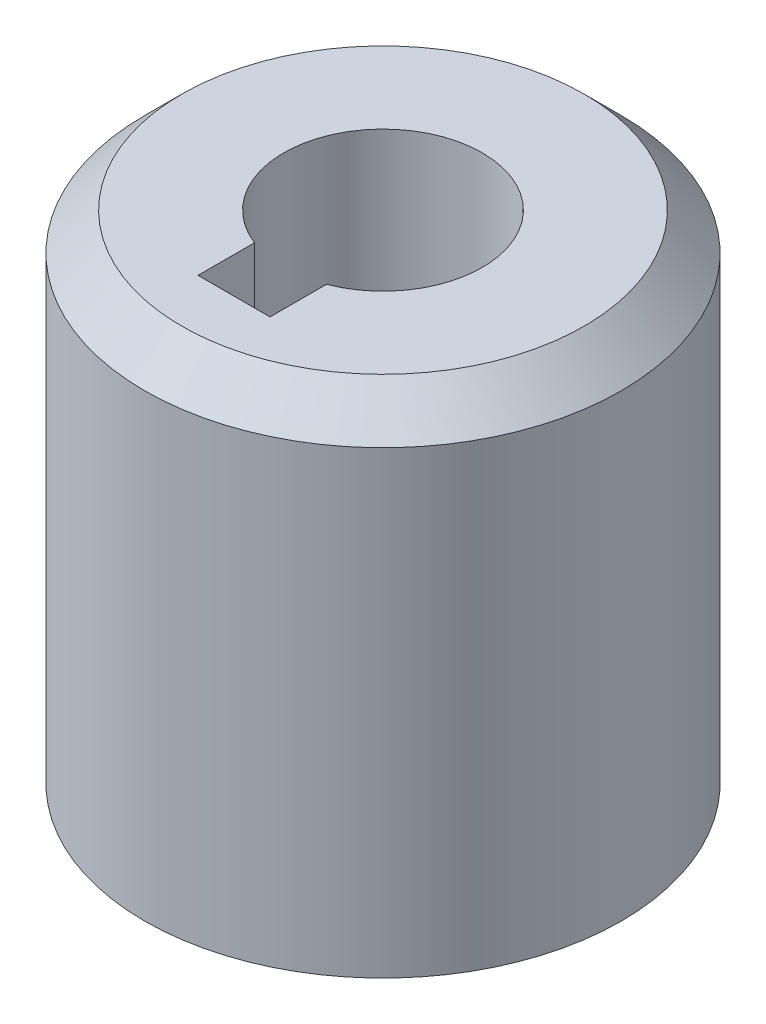
ISO-10303-21;
HEADER;
FILE_DESCRIPTION(('STEP AP214'),'2;1');
FILE_NAME('part.step','',(''),(''),'','','');
FILE_SCHEMA(('AUTOMOTIVE_DESIGN { 1 0 10303 214 1 1 1 1 }'));
ENDSEC;
DATA;
#1=APPLICATION_CONTEXT('core data for automotive mechanical design processes');
#2=APPLICATION_PROTOCOL_DEFINITION('international standard','automotive_design',2000,#1);
#3=PRODUCT_CONTEXT('',#1,'mechanical');
#4=PRODUCT('Part','Part','',(#3));
#5=PRODUCT_RELATED_PRODUCT_CATEGORY('part','',(#4));
#6=PRODUCT_DEFINITION_FORMATION('','',#4);
#7=PRODUCT_DEFINITION_CONTEXT('part definition',#1,'design');
#8=PRODUCT_DEFINITION('design','',#6,#7);
#9=PRODUCT_DEFINITION_SHAPE('','',#8);
#10=(LENGTH_UNIT() NAMED_UNIT(*) SI_UNIT(.MILLI.,.METRE.));
#11=(NAMED_UNIT(*) PLANE_ANGLE_UNIT() SI_UNIT($,.RADIAN.));
#12=(NAMED_UNIT(*) SI_UNIT($,.STERADIAN.) SOLID_ANGLE_UNIT());
#13=UNCERTAINTY_MEASURE_WITH_UNIT(LENGTH_MEASURE(1.E-05),#10,'distance_accuracy_value','');
#14=(GEOMETRIC_REPRESENTATION_CONTEXT(3) GLOBAL_UNCERTAINTY_ASSIGNED_CONTEXT((#13)) GLOBAL_UNIT_ASSIGNED_CONTEXT((#10,
#11,#12)) REPRESENTATION_CONTEXT('',''));
#15=CARTESIAN_POINT('',(0.,0.,0.));
#16=DIRECTION('',(0.,0.,1.));
#17=DIRECTION('',(1.,0.,0.));
#18=AXIS2_PLACEMENT_3D('',#15,#16,#17);
#19=CARTESIAN_POINT('',(0.,20.,0.));
#20=DIRECTION('',(0.,1.,0.));
#21=DIRECTION('',(0.,0.,1.));
#22=AXIS2_PLACEMENT_3D('',#19,#20,#21);
#23=PLANE('',#22);
#24=CARTESIAN_POINT('',(0.,20.,0.));
#25=DIRECTION('',(0.,1.,0.));
#26=DIRECTION('',(0.,0.,1.));
#27=AXIS2_PLACEMENT_3D('',#24,#25,#26);
#28=CIRCLE('',#27,8.1);
#29=CARTESIAN_POINT('',(0.,20.,-8.1));
#30=VERTEX_POINT('',#29);
#31=EDGE_CURVE('E55',#30,#30,#28,.T.);
#32=ORIENTED_EDGE('',*,*,#31,.T.);
#33=EDGE_LOOP('',(#32));
#34=FACE_BOUND('',#33,.T.);
#35=DIRECTION('',(1.,0.,0.));
#36=VECTOR('',#35,1.);
#37=CARTESIAN_POINT('',(-1.45,20.,6.));
#38=LINE('',#37,#36);
#39=CARTESIAN_POINT('',(-1.45,20.,6.));
#40=VERTEX_POINT('',#39);
#41=CARTESIAN_POINT('',(1.45,20.,6.));
#42=VERTEX_POINT('',#41);
#43=EDGE_CURVE('E97',#40,#42,#38,.T.);
#44=ORIENTED_EDGE('',*,*,#43,.F.);
#45=DIRECTION('',(0.,0.,1.));
#46=VECTOR('',#45,1.);
#47=CARTESIAN_POINT('',(-1.45,20.,6.));
#48=LINE('',#47,#46);
#49=CARTESIAN_POINT('',(-1.45,20.,3.72793508527174));
#50=VERTEX_POINT('',#49);
#51=EDGE_CURVE('E88',#50,#40,#48,.T.);
#52=ORIENTED_EDGE('',*,*,#51,.F.);
#53=CARTESIAN_POINT('',(0.,20.,0.));
#54=DIRECTION('',(0.,1.,0.));
#55=DIRECTION('',(0.,0.,1.));
#56=AXIS2_PLACEMENT_3D('',#53,#54,#55);
#57=CIRCLE('',#56,4.);
#58=CARTESIAN_POINT('',(1.45,20.,3.72793508527174));
#59=VERTEX_POINT('',#58);
#60=EDGE_CURVE('E114',#59,#50,#57,.T.);
#61=ORIENTED_EDGE('',*,*,#60,.F.);
#62=DIRECTION('',(0.,0.,-1.));
#63=VECTOR('',#62,1.);
#64=CARTESIAN_POINT('',(1.45,20.,6.));
#65=LINE('',#64,#63);
#66=EDGE_CURVE('E110',#42,#59,#65,.T.);
#67=ORIENTED_EDGE('',*,*,#66,.F.);
#68=EDGE_LOOP('',(#44,#52,#61,#67));
#69=FACE_BOUND('',#68,.T.);
#70=ADVANCED_FACE('F45',(#34,#69),#23,.T.);
#71=CARTESIAN_POINT('',(0.,0.,0.));
#72=DIRECTION('',(0.,1.,0.));
#73=DIRECTION('',(0.,0.,1.));
#74=AXIS2_PLACEMENT_3D('',#71,#72,#73);
#75=PLANE('',#74);
#76=CARTESIAN_POINT('',(0.,0.,0.));
#77=DIRECTION('',(0.,1.,0.));
#78=DIRECTION('',(0.,0.,1.));
#79=AXIS2_PLACEMENT_3D('',#76,#77,#78);
#80=CIRCLE('',#79,9.6);
#81=CARTESIAN_POINT('',(0.,0.,9.6));
#82=VERTEX_POINT('',#81);
#83=EDGE_CURVE('E106',#82,#82,#80,.T.);
#84=ORIENTED_EDGE('',*,*,#83,.F.);
#85=EDGE_LOOP('',(#84));
#86=FACE_BOUND('',#85,.T.);
#87=DIRECTION('',(0.,0.,1.));
#88=VECTOR('',#87,1.);
#89=CARTESIAN_POINT('',(-1.45,0.,6.));
#90=LINE('',#89,#88);
#91=CARTESIAN_POINT('',(-1.45,0.,3.72793508527174));
#92=VERTEX_POINT('',#91);
#93=CARTESIAN_POINT('',(-1.45,0.,6.));
#94=VERTEX_POINT('',#93);
#95=EDGE_CURVE('E70',#92,#94,#90,.T.);
#96=ORIENTED_EDGE('',*,*,#95,.T.);
#97=DIRECTION('',(1.,0.,0.));
#98=VECTOR('',#97,1.);
#99=CARTESIAN_POINT('',(-1.45,0.,6.));
#100=LINE('',#99,#98);
#101=CARTESIAN_POINT('',(1.45,0.,6.));
#102=VERTEX_POINT('',#101);
#103=EDGE_CURVE('E104',#94,#102,#100,.T.);
#104=ORIENTED_EDGE('',*,*,#103,.T.);
#105=DIRECTION('',(0.,0.,-1.));
#106=VECTOR('',#105,1.);
#107=CARTESIAN_POINT('',(1.45,0.,6.));
#108=LINE('',#107,#106);
#109=CARTESIAN_POINT('',(1.45,0.,3.72793508527174));
#110=VERTEX_POINT('',#109);
#111=EDGE_CURVE('E123',#102,#110,#108,.T.);
#112=ORIENTED_EDGE('',*,*,#111,.T.);
#113=CARTESIAN_POINT('',(0.,0.,0.));
#114=DIRECTION('',(0.,1.,0.));
#115=DIRECTION('',(0.,0.,1.));
#116=AXIS2_PLACEMENT_3D('',#113,#114,#115);
#117=CIRCLE('',#116,4.);
#118=EDGE_CURVE('E98',#110,#92,#117,.T.);
#119=ORIENTED_EDGE('',*,*,#118,.T.);
#120=EDGE_LOOP('',(#96,#104,#112,#119));
#121=FACE_BOUND('',#120,.T.);
#122=ADVANCED_FACE('F153',(#86,#121),#75,.F.);
#123=CARTESIAN_POINT('',(0.,20.,0.));
#124=DIRECTION('',(0.,-1.,0.));
#125=DIRECTION('',(0.,0.,-1.));
#126=AXIS2_PLACEMENT_3D('',#123,#124,#125);
#127=CYLINDRICAL_SURFACE('',#126,9.6);
#128=CARTESIAN_POINT('',(0.,18.5,0.));
#129=DIRECTION('',(0.,1.,0.));
#130=DIRECTION('',(0.,0.,1.));
#131=AXIS2_PLACEMENT_3D('',#128,#129,#130);
#132=CIRCLE('',#131,9.6);
#133=CARTESIAN_POINT('',(0.,18.5,-9.6));
#134=VERTEX_POINT('',#133);
#135=EDGE_CURVE('E11',#134,#134,#132,.F.);
#136=ORIENTED_EDGE('',*,*,#135,.T.);
#137=EDGE_LOOP('',(#136));
#138=FACE_BOUND('',#137,.T.);
#139=ORIENTED_EDGE('',*,*,#83,.T.);
#140=EDGE_LOOP('',(#139));
#141=FACE_BOUND('',#140,.T.);
#142=ADVANCED_FACE('F158',(#138,#141),#127,.T.);
#143=CARTESIAN_POINT('',(-1.45,20.,6.));
#144=DIRECTION('',(1.,0.,0.));
#145=DIRECTION('',(0.,0.,-1.));
#146=AXIS2_PLACEMENT_3D('',#143,#144,#145);
#147=PLANE('',#146);
#148=ORIENTED_EDGE('',*,*,#95,.F.);
#149=DIRECTION('',(0.,-1.,0.));
#150=VECTOR('',#149,1.);
#151=CARTESIAN_POINT('',(-1.45,20.,3.72793508527174));
#152=LINE('',#151,#150);
#153=EDGE_CURVE('E92',#50,#92,#152,.T.);
#154=ORIENTED_EDGE('',*,*,#153,.F.);
#155=ORIENTED_EDGE('',*,*,#51,.T.);
#156=DIRECTION('',(0.,-1.,0.));
#157=VECTOR('',#156,1.);
#158=CARTESIAN_POINT('',(-1.45,20.,6.));
#159=LINE('',#158,#157);
#160=EDGE_CURVE('E91',#40,#94,#159,.T.);
#161=ORIENTED_EDGE('',*,*,#160,.T.);
#162=EDGE_LOOP('',(#148,#154,#155,#161));
#163=FACE_BOUND('',#162,.T.);
#164=ADVANCED_FACE('F90',(#163),#147,.T.);
#165=CARTESIAN_POINT('',(-1.45,20.,6.));
#166=DIRECTION('',(0.,0.,-1.));
#167=DIRECTION('',(-1.,0.,0.));
#168=AXIS2_PLACEMENT_3D('',#165,#166,#167);
#169=PLANE('',#168);
#170=ORIENTED_EDGE('',*,*,#103,.F.);
#171=ORIENTED_EDGE('',*,*,#160,.F.);
#172=ORIENTED_EDGE('',*,*,#43,.T.);
#173=DIRECTION('',(0.,-1.,0.));
#174=VECTOR('',#173,1.);
#175=CARTESIAN_POINT('',(1.45,20.,6.));
#176=LINE('',#175,#174);
#177=EDGE_CURVE('E107',#42,#102,#176,.T.);
#178=ORIENTED_EDGE('',*,*,#177,.T.);
#179=EDGE_LOOP('',(#170,#171,#172,#178));
#180=FACE_BOUND('',#179,.T.);
#181=ADVANCED_FACE('F101',(#180),#169,.T.);
#182=CARTESIAN_POINT('',(1.45,20.,6.));
#183=DIRECTION('',(-1.,0.,0.));
#184=DIRECTION('',(0.,0.,1.));
#185=AXIS2_PLACEMENT_3D('',#182,#183,#184);
#186=PLANE('',#185);
#187=ORIENTED_EDGE('',*,*,#111,.F.);
#188=ORIENTED_EDGE('',*,*,#177,.F.);
#189=ORIENTED_EDGE('',*,*,#66,.T.);
#190=DIRECTION('',(0.,-1.,0.));
#191=VECTOR('',#190,1.);
#192=CARTESIAN_POINT('',(1.45,20.,3.72793508527174));
#193=LINE('',#192,#191);
#194=EDGE_CURVE('E62',#59,#110,#193,.T.);
#195=ORIENTED_EDGE('',*,*,#194,.T.);
#196=EDGE_LOOP('',(#187,#188,#189,#195));
#197=FACE_BOUND('',#196,.T.);
#198=ADVANCED_FACE('F149',(#197),#186,.T.);
#199=CARTESIAN_POINT('',(0.,20.,0.));
#200=DIRECTION('',(0.,-1.,0.));
#201=DIRECTION('',(0.,0.,-1.));
#202=AXIS2_PLACEMENT_3D('',#199,#200,#201);
#203=CYLINDRICAL_SURFACE('',#202,4.);
#204=ORIENTED_EDGE('',*,*,#118,.F.);
#205=ORIENTED_EDGE('',*,*,#194,.F.);
#206=ORIENTED_EDGE('',*,*,#60,.T.);
#207=ORIENTED_EDGE('',*,*,#153,.T.);
#208=EDGE_LOOP('',(#204,#205,#206,#207));
#209=FACE_BOUND('',#208,.T.);
#210=ADVANCED_FACE('F144',(#209),#203,.F.);
#211=CARTESIAN_POINT('',(0.,20.,0.));
#212=DIRECTION('',(0.,-1.,0.));
#213=DIRECTION('',(0.,0.,-1.));
#214=AXIS2_PLACEMENT_3D('',#211,#212,#213);
#215=CONICAL_SURFACE('',#214,8.1,0.785398163397445);
#216=CARTESIAN_POINT('',(0.,18.5,-9.6));
#217=CARTESIAN_POINT('',(0.,18.515625,-9.584375));
#218=CARTESIAN_POINT('',(0.,18.53125,-9.56875));
#219=CARTESIAN_POINT('',(0.,18.5625,-9.5375));
#220=CARTESIAN_POINT('',(0.,18.578125,-9.521875));
#221=CARTESIAN_POINT('',(0.,18.609375,-9.490625));
#222=CARTESIAN_POINT('',(0.,18.625,-9.475));
#223=CARTESIAN_POINT('',(0.,18.65625,-9.44375));
#224=CARTESIAN_POINT('',(0.,18.671875,-9.428125));
#225=CARTESIAN_POINT('',(0.,18.703125,-9.396875));
#226=CARTESIAN_POINT('',(0.,18.71875,-9.38125));
#227=CARTESIAN_POINT('',(0.,18.75,-9.35));
#228=CARTESIAN_POINT('',(0.,18.765625,-9.334375));
#229=CARTESIAN_POINT('',(0.,18.796875,-9.303125));
#230=CARTESIAN_POINT('',(0.,18.8125,-9.2875));
#231=CARTESIAN_POINT('',(0.,18.84375,-9.25625));
#232=CARTESIAN_POINT('',(0.,18.859375,-9.240625));
#233=CARTESIAN_POINT('',(0.,18.890625,-9.209375));
#234=CARTESIAN_POINT('',(0.,18.90625,-9.19375));
#235=CARTESIAN_POINT('',(0.,18.9375,-9.1625));
#236=CARTESIAN_POINT('',(0.,18.953125,-9.146875));
#237=CARTESIAN_POINT('',(0.,18.984375,-9.115625));
#238=CARTESIAN_POINT('',(0.,19.,-9.1));
#239=CARTESIAN_POINT('',(0.,19.03125,-9.06875));
#240=CARTESIAN_POINT('',(0.,19.046875,-9.053125));
#241=CARTESIAN_POINT('',(0.,19.078125,-9.021875));
#242=CARTESIAN_POINT('',(0.,19.09375,-9.00625));
#243=CARTESIAN_POINT('',(0.,19.125,-8.975));
#244=CARTESIAN_POINT('',(0.,19.140625,-8.959375));
#245=CARTESIAN_POINT('',(0.,19.171875,-8.928125));
#246=CARTESIAN_POINT('',(0.,19.1875,-8.9125));
#247=CARTESIAN_POINT('',(0.,19.21875,-8.88125));
#248=CARTESIAN_POINT('',(0.,19.234375,-8.865625));
#249=CARTESIAN_POINT('',(0.,19.265625,-8.834375));
#250=CARTESIAN_POINT('',(0.,19.28125,-8.81875));
#251=CARTESIAN_POINT('',(0.,19.3125,-8.7875));
#252=CARTESIAN_POINT('',(0.,19.328125,-8.771875));
#253=CARTESIAN_POINT('',(0.,19.359375,-8.740625));
#254=CARTESIAN_POINT('',(0.,19.375,-8.725));
#255=CARTESIAN_POINT('',(0.,19.40625,-8.69375));
#256=CARTESIAN_POINT('',(0.,19.421875,-8.678125));
#257=CARTESIAN_POINT('',(0.,19.453125,-8.646875));
#258=CARTESIAN_POINT('',(0.,19.46875,-8.63125));
#259=CARTESIAN_POINT('',(0.,19.5,-8.6));
#260=CARTESIAN_POINT('',(0.,19.515625,-8.584375));
#261=CARTESIAN_POINT('',(0.,19.546875,-8.553125));
#262=CARTESIAN_POINT('',(0.,19.5625,-8.5375));
#263=CARTESIAN_POINT('',(0.,19.59375,-8.50625));
#264=CARTESIAN_POINT('',(0.,19.609375,-8.490625));
#265=CARTESIAN_POINT('',(0.,19.640625,-8.459375));
#266=CARTESIAN_POINT('',(0.,19.65625,-8.44375));
#267=CARTESIAN_POINT('',(0.,19.6875,-8.4125));
#268=CARTESIAN_POINT('',(0.,19.703125,-8.396875));
#269=CARTESIAN_POINT('',(0.,19.734375,-8.365625));
#270=CARTESIAN_POINT('',(0.,19.75,-8.35));
#271=CARTESIAN_POINT('',(0.,19.78125,-8.31875));
#272=CARTESIAN_POINT('',(0.,19.796875,-8.303125));
#273=CARTESIAN_POINT('',(0.,19.828125,-8.271875));
#274=CARTESIAN_POINT('',(0.,19.84375,-8.25625));
#275=CARTESIAN_POINT('',(0.,19.875,-8.225));
#276=CARTESIAN_POINT('',(0.,19.890625,-8.209375));
#277=CARTESIAN_POINT('',(0.,19.921875,-8.178125));
#278=CARTESIAN_POINT('',(0.,19.9375,-8.1625));
#279=CARTESIAN_POINT('',(0.,19.96875,-8.13125));
#280=CARTESIAN_POINT('',(0.,19.984375,-8.115625));
#281=CARTESIAN_POINT('',(0.,20.,-8.1));
#282=B_SPLINE_CURVE_WITH_KNOTS('',3,(#216,#217,#218,#219,#220,#221,#222,#223,#224,#225,#226,
#227,#228,#229,#230,#231,#232,#233,#234,#235,#236,#237,#238,#239,#240,#241,#242,#243,#244,#245,
#246,#247,#248,#249,#250,#251,#252,#253,#254,#255,#256,#257,#258,#259,#260,#261,#262,#263,#264,
#265,#266,#267,#268,#269,#270,#271,#272,#273,#274,#275,#276,#277,#278,#279,#280,#281),
.UNSPECIFIED.,.F.,.F.,(4,2,2,2,2,2,2,2,2,2,2,2,2,2,2,2,2,2,2,2,2,2,2,2,2,2,2,2,2,2,2,2,4),(0.,
0.0662912607362401,0.13258252147248,0.198873782208718,0.265165042944958,0.331456303681196,
0.397747564417436,0.464038825153676,0.530330085889913,0.596621346626154,0.662912607362391,
0.729203868098631,0.795495128834872,0.861786389571109,0.928077650307349,0.994368911043587,
1.06066017177983,1.12695143251607,1.1932426932523,1.25953395398855,1.32582521472478,
1.39211647546102,1.45840773619726,1.5246989969335,1.59099025766974,1.65728151840598,
1.72357277914222,1.78986403987846,1.8561553006147,1.92244656135094,1.98873782208718,
2.05502908282342,2.12132034355966),.UNSPECIFIED.);
#283=EDGE_CURVE('BSEAM48',#134,#30,#282,.T.);
#284=ORIENTED_EDGE('',*,*,#135,.F.);
#285=ORIENTED_EDGE('',*,*,#31,.F.);
#286=ORIENTED_EDGE('',*,*,#283,.T.);
#287=ORIENTED_EDGE('',*,*,#283,.F.);
#288=EDGE_LOOP('',(#284,#286,#285,#287));
#289=FACE_BOUND('',#288,.T.);
#290=ADVANCED_FACE('F48',(#289),#215,.T.);
#291=CLOSED_SHELL('',(#70,#122,#142,#164,#181,#198,#210,#290));
#292=MANIFOLD_SOLID_BREP('B2',#291);
#293=ADVANCED_BREP_SHAPE_REPRESENTATION('',(#18,#292),#14);
#294=SHAPE_DEFINITION_REPRESENTATION(#9,#293);
ENDSEC;
END-ISO-10303-21;
